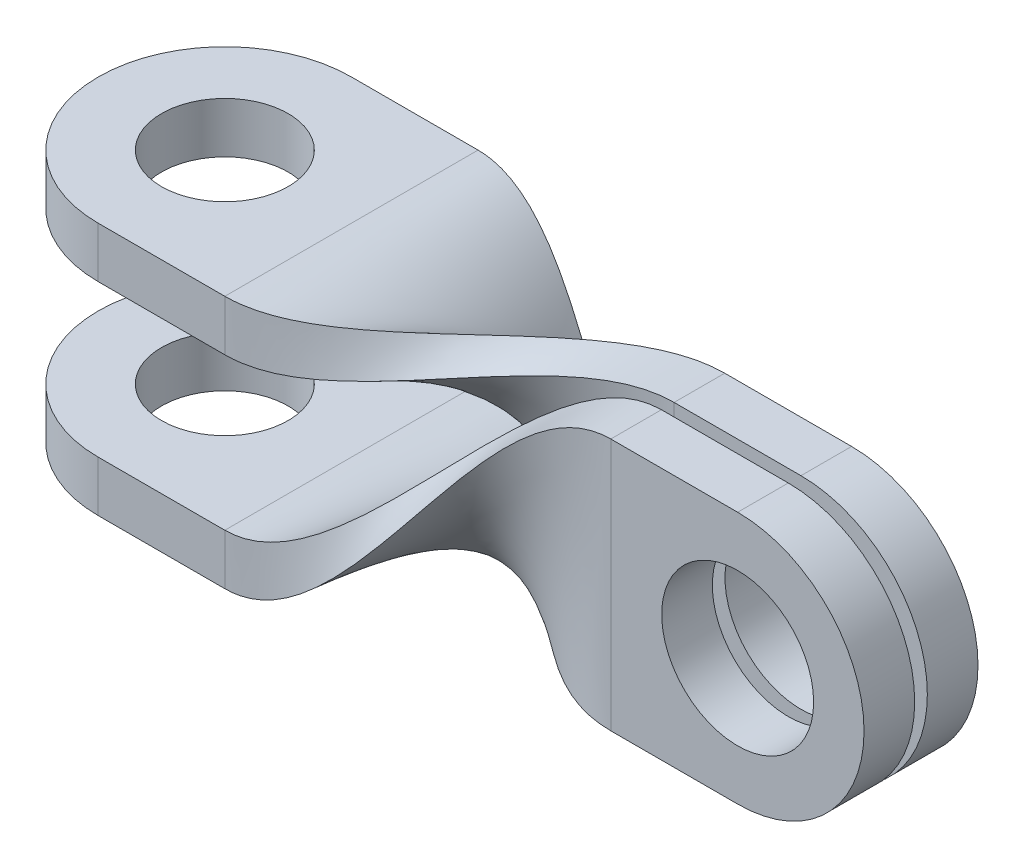
ISO-10303-21;
HEADER;
FILE_DESCRIPTION(('STEP AP214'),'2;1');
FILE_NAME('part.step','',(''),(''),'','','');
FILE_SCHEMA(('AUTOMOTIVE_DESIGN { 1 0 10303 214 1 1 1 1 }'));
ENDSEC;
DATA;
#1=APPLICATION_CONTEXT('core data for automotive mechanical design processes');
#2=APPLICATION_PROTOCOL_DEFINITION('international standard','automotive_design',2000,#1);
#3=PRODUCT_CONTEXT('',#1,'mechanical');
#4=PRODUCT('Part','Part','',(#3));
#5=PRODUCT_RELATED_PRODUCT_CATEGORY('part','',(#4));
#6=PRODUCT_DEFINITION_FORMATION('','',#4);
#7=PRODUCT_DEFINITION_CONTEXT('part definition',#1,'design');
#8=PRODUCT_DEFINITION('design','',#6,#7);
#9=PRODUCT_DEFINITION_SHAPE('','',#8);
#10=(LENGTH_UNIT() NAMED_UNIT(*) SI_UNIT(.MILLI.,.METRE.));
#11=(NAMED_UNIT(*) PLANE_ANGLE_UNIT() SI_UNIT($,.RADIAN.));
#12=(NAMED_UNIT(*) SI_UNIT($,.STERADIAN.) SOLID_ANGLE_UNIT());
#13=UNCERTAINTY_MEASURE_WITH_UNIT(LENGTH_MEASURE(1.E-05),#10,'distance_accuracy_value','');
#14=(GEOMETRIC_REPRESENTATION_CONTEXT(3) GLOBAL_UNCERTAINTY_ASSIGNED_CONTEXT((#13)) GLOBAL_UNIT_ASSIGNED_CONTEXT((#10,
#11,#12)) REPRESENTATION_CONTEXT('',''));
#15=CARTESIAN_POINT('',(0.,0.,0.));
#16=DIRECTION('',(0.,0.,1.));
#17=DIRECTION('',(1.,0.,0.));
#18=AXIS2_PLACEMENT_3D('',#15,#16,#17);
#19=CARTESIAN_POINT('',(-88.9,25.4,-25.4));
#20=DIRECTION('',(0.,0.,1.));
#21=DIRECTION('',(1.,0.,0.));
#22=AXIS2_PLACEMENT_3D('',#19,#20,#21);
#23=PLANE('',#22);
#24=DIRECTION('',(-1.,0.,0.));
#25=VECTOR('',#24,1.);
#26=CARTESIAN_POINT('',(-88.9,-15.24,-25.4));
#27=LINE('',#26,#25);
#28=CARTESIAN_POINT('',(-88.9,-15.24,-25.4));
#29=VERTEX_POINT('',#28);
#30=CARTESIAN_POINT('',(-114.3,-15.24,-25.4));
#31=VERTEX_POINT('',#30);
#32=EDGE_CURVE('E779',#29,#31,#27,.T.);
#33=ORIENTED_EDGE('',*,*,#32,.F.);
#34=DIRECTION('',(0.,1.,0.));
#35=VECTOR('',#34,1.);
#36=CARTESIAN_POINT('',(-88.9,25.4,-25.4));
#37=LINE('',#36,#35);
#38=CARTESIAN_POINT('',(-88.9,-25.4,-25.4));
#39=VERTEX_POINT('',#38);
#40=EDGE_CURVE('E788',#29,#39,#37,.F.);
#41=ORIENTED_EDGE('',*,*,#40,.T.);
#42=DIRECTION('',(-1.,0.,0.));
#43=VECTOR('',#42,1.);
#44=CARTESIAN_POINT('',(-88.9,-25.4,-25.4));
#45=LINE('',#44,#43);
#46=CARTESIAN_POINT('',(-114.3,-25.4,-25.4));
#47=VERTEX_POINT('',#46);
#48=EDGE_CURVE('E784',#39,#47,#45,.T.);
#49=ORIENTED_EDGE('',*,*,#48,.T.);
#50=DIRECTION('',(0.,-1.,0.));
#51=VECTOR('',#50,1.);
#52=CARTESIAN_POINT('',(-114.3,25.4,-25.4));
#53=LINE('',#52,#51);
#54=EDGE_CURVE('E773',#31,#47,#53,.T.);
#55=ORIENTED_EDGE('',*,*,#54,.F.);
#56=EDGE_LOOP('',(#33,#41,#49,#55));
#57=FACE_BOUND('',#56,.T.);
#58=ADVANCED_FACE('F526',(#57),#23,.F.);
#59=CARTESIAN_POINT('',(-114.3,25.4,0.));
#60=DIRECTION('',(0.,-1.,0.));
#61=DIRECTION('',(0.,0.,-1.));
#62=AXIS2_PLACEMENT_3D('',#59,#60,#61);
#63=CYLINDRICAL_SURFACE('',#62,25.4);
#64=CARTESIAN_POINT('',(-114.3,-15.24,0.));
#65=DIRECTION('',(0.,1.,0.));
#66=DIRECTION('',(0.,0.,1.));
#67=AXIS2_PLACEMENT_3D('',#64,#65,#66);
#68=CIRCLE('',#67,25.4);
#69=CARTESIAN_POINT('',(-114.3,-15.24,25.4));
#70=VERTEX_POINT('',#69);
#71=EDGE_CURVE('E537',#31,#70,#68,.T.);
#72=ORIENTED_EDGE('',*,*,#71,.F.);
#73=ORIENTED_EDGE('',*,*,#54,.T.);
#74=CARTESIAN_POINT('',(-114.3,-25.4,0.));
#75=DIRECTION('',(0.,1.,0.));
#76=DIRECTION('',(0.,0.,1.));
#77=AXIS2_PLACEMENT_3D('',#74,#75,#76);
#78=CIRCLE('',#77,25.4);
#79=CARTESIAN_POINT('',(-114.3,-25.4,25.4));
#80=VERTEX_POINT('',#79);
#81=EDGE_CURVE('E769',#47,#80,#78,.T.);
#82=ORIENTED_EDGE('',*,*,#81,.T.);
#83=DIRECTION('',(0.,-1.,0.));
#84=VECTOR('',#83,1.);
#85=CARTESIAN_POINT('',(-114.3,25.4,25.4));
#86=LINE('',#85,#84);
#87=EDGE_CURVE('E772',#70,#80,#86,.T.);
#88=ORIENTED_EDGE('',*,*,#87,.F.);
#89=EDGE_LOOP('',(#72,#73,#82,#88));
#90=FACE_BOUND('',#89,.T.);
#91=ADVANCED_FACE('F853',(#90),#63,.T.);
#92=CARTESIAN_POINT('',(-114.3,25.4,25.4));
#93=DIRECTION('',(0.,0.,-1.));
#94=DIRECTION('',(-1.,0.,0.));
#95=AXIS2_PLACEMENT_3D('',#92,#93,#94);
#96=PLANE('',#95);
#97=DIRECTION('',(1.,0.,0.));
#98=VECTOR('',#97,1.);
#99=CARTESIAN_POINT('',(-114.3,-15.24,25.4));
#100=LINE('',#99,#98);
#101=CARTESIAN_POINT('',(-88.9,-15.24,25.4));
#102=VERTEX_POINT('',#101);
#103=EDGE_CURVE('E14',#70,#102,#100,.T.);
#104=ORIENTED_EDGE('',*,*,#103,.F.);
#105=ORIENTED_EDGE('',*,*,#87,.T.);
#106=DIRECTION('',(1.,0.,0.));
#107=VECTOR('',#106,1.);
#108=CARTESIAN_POINT('',(-114.3,-25.4,25.4));
#109=LINE('',#108,#107);
#110=CARTESIAN_POINT('',(-88.9,-25.4,25.4));
#111=VERTEX_POINT('',#110);
#112=EDGE_CURVE('E782',#80,#111,#109,.T.);
#113=ORIENTED_EDGE('',*,*,#112,.T.);
#114=DIRECTION('',(0.,1.,0.));
#115=VECTOR('',#114,1.);
#116=CARTESIAN_POINT('',(-88.9,25.4,25.4));
#117=LINE('',#116,#115);
#118=EDGE_CURVE('E798',#102,#111,#117,.F.);
#119=ORIENTED_EDGE('',*,*,#118,.F.);
#120=EDGE_LOOP('',(#104,#105,#113,#119));
#121=FACE_BOUND('',#120,.T.);
#122=ADVANCED_FACE('F858',(#121),#96,.F.);
#123=CARTESIAN_POINT('',(-114.3,25.4,0.));
#124=DIRECTION('',(0.,-1.,0.));
#125=DIRECTION('',(0.,0.,-1.));
#126=AXIS2_PLACEMENT_3D('',#123,#124,#125);
#127=CYLINDRICAL_SURFACE('',#126,12.7);
#128=CARTESIAN_POINT('',(-114.3,-25.4,0.));
#129=DIRECTION('',(0.,1.,0.));
#130=DIRECTION('',(0.,0.,1.));
#131=AXIS2_PLACEMENT_3D('',#128,#129,#130);
#132=CIRCLE('',#131,12.7);
#133=CARTESIAN_POINT('',(-114.3,-25.4,12.7));
#134=VERTEX_POINT('',#133);
#135=EDGE_CURVE('E774',#134,#134,#132,.T.);
#136=ORIENTED_EDGE('',*,*,#135,.F.);
#137=EDGE_LOOP('',(#136));
#138=FACE_BOUND('',#137,.T.);
#139=CARTESIAN_POINT('',(-114.3,-15.24,0.));
#140=DIRECTION('',(0.,1.,0.));
#141=DIRECTION('',(0.,0.,1.));
#142=AXIS2_PLACEMENT_3D('',#139,#140,#141);
#143=CIRCLE('',#142,12.7);
#144=CARTESIAN_POINT('',(-114.3,-15.24,12.7));
#145=VERTEX_POINT('',#144);
#146=EDGE_CURVE('E777',#145,#145,#143,.T.);
#147=ORIENTED_EDGE('',*,*,#146,.T.);
#148=EDGE_LOOP('',(#147));
#149=FACE_BOUND('',#148,.T.);
#150=ADVANCED_FACE('F528',(#138,#149),#127,.F.);
#151=CARTESIAN_POINT('',(-114.3,-25.4,0.));
#152=DIRECTION('',(0.,1.,0.));
#153=DIRECTION('',(0.,0.,1.));
#154=AXIS2_PLACEMENT_3D('',#151,#152,#153);
#155=PLANE('',#154);
#156=DIRECTION('',(0.,0.,1.));
#157=VECTOR('',#156,1.);
#158=CARTESIAN_POINT('',(-88.9,-25.4,0.));
#159=LINE('',#158,#157);
#160=EDGE_CURVE('E795',#111,#39,#159,.F.);
#161=ORIENTED_EDGE('',*,*,#160,.F.);
#162=ORIENTED_EDGE('',*,*,#112,.F.);
#163=ORIENTED_EDGE('',*,*,#81,.F.);
#164=ORIENTED_EDGE('',*,*,#48,.F.);
#165=EDGE_LOOP('',(#161,#162,#163,#164));
#166=FACE_BOUND('',#165,.T.);
#167=ORIENTED_EDGE('',*,*,#135,.T.);
#168=EDGE_LOOP('',(#167));
#169=FACE_BOUND('',#168,.T.);
#170=ADVANCED_FACE('F910',(#166,#169),#155,.F.);
#171=CARTESIAN_POINT('',(-114.3,-15.24,0.));
#172=DIRECTION('',(0.,1.,0.));
#173=DIRECTION('',(0.,0.,1.));
#174=AXIS2_PLACEMENT_3D('',#171,#172,#173);
#175=PLANE('',#174);
#176=ORIENTED_EDGE('',*,*,#146,.F.);
#177=EDGE_LOOP('',(#176));
#178=FACE_BOUND('',#177,.T.);
#179=DIRECTION('',(0.,0.,1.));
#180=VECTOR('',#179,1.);
#181=CARTESIAN_POINT('',(-88.9,-15.24,0.));
#182=LINE('',#181,#180);
#183=EDGE_CURVE('E567',#102,#29,#182,.F.);
#184=ORIENTED_EDGE('',*,*,#183,.T.);
#185=ORIENTED_EDGE('',*,*,#32,.T.);
#186=ORIENTED_EDGE('',*,*,#71,.T.);
#187=ORIENTED_EDGE('',*,*,#103,.T.);
#188=EDGE_LOOP('',(#184,#185,#186,#187));
#189=FACE_BOUND('',#188,.T.);
#190=ADVANCED_FACE('F918',(#178,#189),#175,.T.);
#191=CARTESIAN_POINT('',(-25.4473043803096,-25.3526956196904,11.43));
#192=CARTESIAN_POINT('',(-48.581035214057,-25.3526956196904,11.43));
#193=CARTESIAN_POINT('',(-65.7662691662526,-25.4,-25.4));
#194=CARTESIAN_POINT('',(-88.9,-25.4,-25.4));
#195=CARTESIAN_POINT('',(-25.4473043803096,-16.9017970797936,11.43));
#196=CARTESIAN_POINT('',(-48.0227228561521,-16.9017970797936,11.43));
#197=CARTESIAN_POINT('',(-66.3245815241575,-25.4,-16.9333333333333));
#198=CARTESIAN_POINT('',(-88.9,-25.4,-16.9333333333333));
#199=CARTESIAN_POINT('',(-25.4473043803096,0.,11.43));
#200=CARTESIAN_POINT('',(-46.9060981403421,0.,11.43));
#201=CARTESIAN_POINT('',(-67.4412062399675,-25.4,0.));
#202=CARTESIAN_POINT('',(-88.9,-25.4,0.));
#203=CARTESIAN_POINT('',(-25.4473043803096,16.9017970797936,11.43));
#204=CARTESIAN_POINT('',(-49.2331933140537,16.9017970797936,11.43));
#205=CARTESIAN_POINT('',(-65.1141110662559,-25.4,16.9333333333333));
#206=CARTESIAN_POINT('',(-88.9,-25.4,16.9333333333333));
#207=CARTESIAN_POINT('',(-25.4473043803096,25.3526956196904,11.43));
#208=CARTESIAN_POINT('',(-50.3967409009095,25.3526956196904,11.43));
#209=CARTESIAN_POINT('',(-63.9505634794001,-25.4,25.4));
#210=CARTESIAN_POINT('',(-88.9,-25.4,25.4));
#211=B_SPLINE_SURFACE_WITH_KNOTS('',3,3,((#191,#192,#193,#194),(#195,#196,#197,#198),(#199,#200,
#201,#202),(#203,#204,#205,#206),(#207,#208,#209,#210)),.UNSPECIFIED.,.F.,.F.,.F.,(4,1,4),(4,4),
(0.,0.5,1.),(0.,1.),.UNSPECIFIED.);
#212=DIRECTION('',(0.,-1.,0.));
#213=VECTOR('',#212,1.);
#214=CARTESIAN_POINT('',(-25.4473043803096,25.3526956196904,11.43));
#215=LINE('',#214,#213);
#216=CARTESIAN_POINT('',(-25.4473043803096,25.3526956196904,11.43));
#217=VERTEX_POINT('',#216);
#218=CARTESIAN_POINT('',(-25.4473043803096,-25.3526956196904,11.43));
#219=VERTEX_POINT('',#218);
#220=EDGE_CURVE('E580',#217,#219,#215,.T.);
#221=CARTESIAN_POINT('',(-25.4473043803096,25.3526956196904,11.43));
#222=CARTESIAN_POINT('',(-50.3967409009095,25.3526956196904,11.43));
#223=CARTESIAN_POINT('',(-63.9505634794001,-25.4,25.4));
#224=CARTESIAN_POINT('',(-88.9,-25.4,25.4));
#225=B_SPLINE_CURVE_WITH_KNOTS('',3,(#221,#222,#223,#224),.UNSPECIFIED.,.F.,.F.,(4,4),(0.,1.),.UNSPECIFIED.);
#226=EDGE_CURVE('E644',#217,#111,#225,.T.);
#227=CARTESIAN_POINT('',(-25.4473043803096,-25.3526956196904,11.43));
#228=CARTESIAN_POINT('',(-48.581035214057,-25.3526956196904,11.43));
#229=CARTESIAN_POINT('',(-65.7662691662526,-25.4,-25.4));
#230=CARTESIAN_POINT('',(-88.9,-25.4,-25.4));
#231=B_SPLINE_CURVE_WITH_KNOTS('',3,(#227,#228,#229,#230),.UNSPECIFIED.,.F.,.F.,(4,4),(0.,1.),.UNSPECIFIED.);
#232=EDGE_CURVE('E691',#39,#219,#231,.F.);
#233=ORIENTED_EDGE('',*,*,#220,.F.);
#234=ORIENTED_EDGE('',*,*,#226,.T.);
#235=ORIENTED_EDGE('',*,*,#160,.T.);
#236=ORIENTED_EDGE('',*,*,#232,.T.);
#237=EDGE_LOOP('',(#233,#234,#235,#236));
#238=FACE_BOUND('',#237,.T.);
#239=ADVANCED_FACE('F659',(#238),#211,.T.);
#240=CARTESIAN_POINT('',(-25.4473043803096,25.3526956196904,11.43));
#241=CARTESIAN_POINT('',(-50.3967409009095,25.3526956196904,11.43));
#242=CARTESIAN_POINT('',(-63.9505634794001,-25.4,25.4));
#243=CARTESIAN_POINT('',(-88.9,-25.4,25.4));
#244=CARTESIAN_POINT('',(-25.4473043803096,25.3526956196904,9.73666666666667));
#245=CARTESIAN_POINT('',(-50.2548426638721,25.3526956196904,9.73666666666667));
#246=CARTESIAN_POINT('',(-64.0924617164375,-23.7066666666667,25.4));
#247=CARTESIAN_POINT('',(-88.9,-23.7066666666667,25.4));
#248=CARTESIAN_POINT('',(-25.4473043803096,25.3526956196904,6.35));
#249=CARTESIAN_POINT('',(-49.9710461897974,25.3526956196904,6.35));
#250=CARTESIAN_POINT('',(-64.3762581905122,-20.32,25.4));
#251=CARTESIAN_POINT('',(-88.9,-20.32,25.4));
#252=CARTESIAN_POINT('',(-25.4473043803096,25.3526956196904,2.96333333333333));
#253=CARTESIAN_POINT('',(-49.8083347983741,25.3526956196904,2.96333333333333));
#254=CARTESIAN_POINT('',(-64.5389695819355,-16.9333333333333,25.4));
#255=CARTESIAN_POINT('',(-88.9,-16.9333333333333,25.4));
#256=CARTESIAN_POINT('',(-25.4473043803096,25.3526956196904,1.27));
#257=CARTESIAN_POINT('',(-49.7269791026625,25.3526956196904,1.27));
#258=CARTESIAN_POINT('',(-64.6203252776471,-15.24,25.4));
#259=CARTESIAN_POINT('',(-88.9,-15.24,25.4));
#260=B_SPLINE_SURFACE_WITH_KNOTS('',3,3,((#240,#241,#242,#243),(#244,#245,#246,#247),(#248,#249,
#250,#251),(#252,#253,#254,#255),(#256,#257,#258,#259)),.UNSPECIFIED.,.F.,.F.,.F.,(4,1,4),(4,4),
(0.,0.5,1.),(0.,1.),.UNSPECIFIED.);
#261=DIRECTION('',(0.,0.,-1.));
#262=VECTOR('',#261,1.);
#263=CARTESIAN_POINT('',(-25.4473043803096,25.3526956196904,11.43));
#264=LINE('',#263,#262);
#265=CARTESIAN_POINT('',(-25.4473043803096,25.3526956196904,1.27));
#266=VERTEX_POINT('',#265);
#267=EDGE_CURVE('E638',#217,#266,#264,.T.);
#268=CARTESIAN_POINT('',(-25.4473043803096,25.3526956196904,1.27));
#269=CARTESIAN_POINT('',(-49.7269791026625,25.3526956196904,1.27));
#270=CARTESIAN_POINT('',(-64.6203252776471,-15.24,25.4));
#271=CARTESIAN_POINT('',(-88.9,-15.24,25.4));
#272=B_SPLINE_CURVE_WITH_KNOTS('',3,(#268,#269,#270,#271),.UNSPECIFIED.,.F.,.F.,(4,4),(0.,1.),.UNSPECIFIED.);
#273=EDGE_CURVE('E572',#266,#102,#272,.T.);
#274=ORIENTED_EDGE('',*,*,#267,.T.);
#275=ORIENTED_EDGE('',*,*,#273,.T.);
#276=ORIENTED_EDGE('',*,*,#118,.T.);
#277=ORIENTED_EDGE('',*,*,#226,.F.);
#278=EDGE_LOOP('',(#274,#275,#276,#277));
#279=FACE_BOUND('',#278,.T.);
#280=ADVANCED_FACE('F646',(#279),#260,.T.);
#281=CARTESIAN_POINT('',(-25.4473043803096,-25.3526956196904,1.27));
#282=CARTESIAN_POINT('',(-47.8213981535163,-25.3526956196904,1.27));
#283=CARTESIAN_POINT('',(-66.5259062267933,-15.24,-25.4));
#284=CARTESIAN_POINT('',(-88.9,-15.24,-25.4));
#285=CARTESIAN_POINT('',(-25.4473043803096,-25.3526956196904,2.96333333333333));
#286=CARTESIAN_POINT('',(-47.9143390951241,-25.3526956196904,2.96333333333333));
#287=CARTESIAN_POINT('',(-66.4329652851855,-16.9333333333333,-25.4));
#288=CARTESIAN_POINT('',(-88.9,-16.9333333333333,-25.4));
#289=CARTESIAN_POINT('',(-25.4473043803096,-25.3526956196904,6.35));
#290=CARTESIAN_POINT('',(-48.1002209783396,-25.3526956196904,6.35));
#291=CARTESIAN_POINT('',(-66.24708340197,-20.32,-25.4));
#292=CARTESIAN_POINT('',(-88.9,-20.32,-25.4));
#293=CARTESIAN_POINT('',(-25.4473043803096,-25.3526956196904,9.73666666666667));
#294=CARTESIAN_POINT('',(-48.4207638021512,-25.3526956196904,9.73666666666667));
#295=CARTESIAN_POINT('',(-65.9265405781584,-23.7066666666667,-25.4));
#296=CARTESIAN_POINT('',(-88.9,-23.7066666666667,-25.4));
#297=CARTESIAN_POINT('',(-25.4473043803096,-25.3526956196904,11.43));
#298=CARTESIAN_POINT('',(-48.581035214057,-25.3526956196904,11.43));
#299=CARTESIAN_POINT('',(-65.7662691662526,-25.4,-25.4));
#300=CARTESIAN_POINT('',(-88.9,-25.4,-25.4));
#301=B_SPLINE_SURFACE_WITH_KNOTS('',3,3,((#281,#282,#283,#284),(#285,#286,#287,#288),(#289,#290,
#291,#292),(#293,#294,#295,#296),(#297,#298,#299,#300)),.UNSPECIFIED.,.F.,.F.,.F.,(4,1,4),(4,4),
(0.,0.5,1.),(0.,1.),.UNSPECIFIED.);
#302=DIRECTION('',(0.,0.,-1.));
#303=VECTOR('',#302,1.);
#304=CARTESIAN_POINT('',(-25.4473043803096,-25.3526956196904,11.43));
#305=LINE('',#304,#303);
#306=CARTESIAN_POINT('',(-25.4473043803096,-25.3526956196904,1.27));
#307=VERTEX_POINT('',#306);
#308=EDGE_CURVE('E758',#219,#307,#305,.T.);
#309=CARTESIAN_POINT('',(-25.4473043803096,-25.3526956196904,1.27));
#310=CARTESIAN_POINT('',(-47.8213981535163,-25.3526956196904,1.27));
#311=CARTESIAN_POINT('',(-66.5259062267933,-15.24,-25.4));
#312=CARTESIAN_POINT('',(-88.9,-15.24,-25.4));
#313=B_SPLINE_CURVE_WITH_KNOTS('',3,(#309,#310,#311,#312),.UNSPECIFIED.,.F.,.F.,(4,4),(0.,1.),.UNSPECIFIED.);
#314=EDGE_CURVE('E800',#307,#29,#313,.T.);
#315=ORIENTED_EDGE('',*,*,#308,.F.);
#316=ORIENTED_EDGE('',*,*,#232,.F.);
#317=ORIENTED_EDGE('',*,*,#40,.F.);
#318=ORIENTED_EDGE('',*,*,#314,.F.);
#319=EDGE_LOOP('',(#315,#316,#317,#318));
#320=FACE_BOUND('',#319,.T.);
#321=ADVANCED_FACE('F658',(#320),#301,.T.);
#322=CARTESIAN_POINT('',(-25.4473043803096,25.3526956196904,1.27));
#323=CARTESIAN_POINT('',(-49.7269791026625,25.3526956196904,1.27));
#324=CARTESIAN_POINT('',(-64.6203252776471,-15.24,25.4));
#325=CARTESIAN_POINT('',(-88.9,-15.24,25.4));
#326=CARTESIAN_POINT('',(-25.4473043803096,16.9017970797936,1.27));
#327=CARTESIAN_POINT('',(-48.5030755698833,16.9017970797936,1.27));
#328=CARTESIAN_POINT('',(-65.8442288104263,-15.24,16.9333333333333));
#329=CARTESIAN_POINT('',(-88.9,-15.24,16.9333333333333));
#330=CARTESIAN_POINT('',(-25.4473043803096,0.,1.27));
#331=CARTESIAN_POINT('',(-46.0552685043249,0.,1.27));
#332=CARTESIAN_POINT('',(-68.2920358759847,-15.24,0.));
#333=CARTESIAN_POINT('',(-88.9,-15.24,0.));
#334=CARTESIAN_POINT('',(-25.4473043803096,-16.9017970797936,1.27));
#335=CARTESIAN_POINT('',(-47.2326882704525,-16.9017970797936,1.27));
#336=CARTESIAN_POINT('',(-67.1146161098571,-15.24,-16.9333333333333));
#337=CARTESIAN_POINT('',(-88.9,-15.24,-16.9333333333333));
#338=CARTESIAN_POINT('',(-25.4473043803096,-25.3526956196904,1.27));
#339=CARTESIAN_POINT('',(-47.8213981535163,-25.3526956196904,1.27));
#340=CARTESIAN_POINT('',(-66.5259062267933,-15.24,-25.4));
#341=CARTESIAN_POINT('',(-88.9,-15.24,-25.4));
#342=B_SPLINE_SURFACE_WITH_KNOTS('',3,3,((#322,#323,#324,#325),(#326,#327,#328,#329),(#330,#331,
#332,#333),(#334,#335,#336,#337),(#338,#339,#340,#341)),.UNSPECIFIED.,.F.,.F.,.F.,(4,1,4),(4,4),
(0.,0.5,1.),(0.,1.),.UNSPECIFIED.);
#343=DIRECTION('',(0.,-1.,0.));
#344=VECTOR('',#343,1.);
#345=CARTESIAN_POINT('',(-25.4473043803096,25.3526956196904,1.27));
#346=LINE('',#345,#344);
#347=EDGE_CURVE('E530',#266,#307,#346,.T.);
#348=ORIENTED_EDGE('',*,*,#347,.T.);
#349=ORIENTED_EDGE('',*,*,#314,.T.);
#350=ORIENTED_EDGE('',*,*,#183,.F.);
#351=ORIENTED_EDGE('',*,*,#273,.F.);
#352=EDGE_LOOP('',(#348,#349,#350,#351));
#353=FACE_BOUND('',#352,.T.);
#354=ADVANCED_FACE('F674',(#353),#342,.T.);
#355=CARTESIAN_POINT('',(0.,0.,11.43));
#356=DIRECTION('',(0.,0.,1.));
#357=DIRECTION('',(1.,0.,0.));
#358=AXIS2_PLACEMENT_3D('',#355,#356,#357);
#359=PLANE('',#358);
#360=DIRECTION('',(-1.,0.,0.));
#361=VECTOR('',#360,1.);
#362=CARTESIAN_POINT('',(0.,25.3526956196904,11.43));
#363=LINE('',#362,#361);
#364=CARTESIAN_POINT('',(0.,25.3526956196904,11.43));
#365=VERTEX_POINT('',#364);
#366=EDGE_CURVE('E613',#365,#217,#363,.T.);
#367=ORIENTED_EDGE('',*,*,#366,.T.);
#368=ORIENTED_EDGE('',*,*,#220,.T.);
#369=DIRECTION('',(1.,0.,0.));
#370=VECTOR('',#369,1.);
#371=CARTESIAN_POINT('',(-25.4473043803096,-25.3526956196904,11.43));
#372=LINE('',#371,#370);
#373=CARTESIAN_POINT('',(0.,-25.3526956196904,11.43));
#374=VERTEX_POINT('',#373);
#375=EDGE_CURVE('E602',#219,#374,#372,.T.);
#376=ORIENTED_EDGE('',*,*,#375,.T.);
#377=CARTESIAN_POINT('',(0.,0.,11.43));
#378=DIRECTION('',(0.,0.,1.));
#379=DIRECTION('',(1.,0.,0.));
#380=AXIS2_PLACEMENT_3D('',#377,#378,#379);
#381=CIRCLE('',#380,25.3526956196904);
#382=EDGE_CURVE('E608',#374,#365,#381,.T.);
#383=ORIENTED_EDGE('',*,*,#382,.T.);
#384=EDGE_LOOP('',(#367,#368,#376,#383));
#385=FACE_BOUND('',#384,.T.);
#386=CARTESIAN_POINT('',(0.,0.,11.43));
#387=DIRECTION('',(0.,0.,1.));
#388=DIRECTION('',(1.,0.,0.));
#389=AXIS2_PLACEMENT_3D('',#386,#387,#388);
#390=CIRCLE('',#389,15.24);
#391=CARTESIAN_POINT('',(15.24,0.,11.43));
#392=VERTEX_POINT('',#391);
#393=EDGE_CURVE('E725',#392,#392,#390,.T.);
#394=ORIENTED_EDGE('',*,*,#393,.F.);
#395=EDGE_LOOP('',(#394));
#396=FACE_BOUND('',#395,.T.);
#397=ADVANCED_FACE('F605',(#385,#396),#359,.T.);
#398=CARTESIAN_POINT('',(0.,0.,1.27));
#399=DIRECTION('',(0.,0.,1.));
#400=DIRECTION('',(1.,0.,0.));
#401=AXIS2_PLACEMENT_3D('',#398,#399,#400);
#402=PLANE('',#401);
#403=DIRECTION('',(-1.,0.,0.));
#404=VECTOR('',#403,1.);
#405=CARTESIAN_POINT('',(0.,25.3526956196904,1.27));
#406=LINE('',#405,#404);
#407=CARTESIAN_POINT('',(0.,25.3526956196904,1.27));
#408=VERTEX_POINT('',#407);
#409=EDGE_CURVE('E722',#408,#266,#406,.T.);
#410=ORIENTED_EDGE('',*,*,#409,.F.);
#411=CARTESIAN_POINT('',(0.,0.,1.27));
#412=DIRECTION('',(0.,0.,1.));
#413=DIRECTION('',(1.,0.,0.));
#414=AXIS2_PLACEMENT_3D('',#411,#412,#413);
#415=CIRCLE('',#414,25.3526956196904);
#416=CARTESIAN_POINT('',(0.,-25.3526956196904,1.27));
#417=VERTEX_POINT('',#416);
#418=EDGE_CURVE('E633',#417,#408,#415,.T.);
#419=ORIENTED_EDGE('',*,*,#418,.F.);
#420=DIRECTION('',(1.,0.,0.));
#421=VECTOR('',#420,1.);
#422=CARTESIAN_POINT('',(-25.4473043803096,-25.3526956196904,1.27));
#423=LINE('',#422,#421);
#424=EDGE_CURVE('E619',#307,#417,#423,.T.);
#425=ORIENTED_EDGE('',*,*,#424,.F.);
#426=ORIENTED_EDGE('',*,*,#347,.F.);
#427=EDGE_LOOP('',(#410,#419,#425,#426));
#428=FACE_BOUND('',#427,.T.);
#429=CARTESIAN_POINT('',(0.,0.,1.27));
#430=DIRECTION('',(0.,0.,1.));
#431=DIRECTION('',(1.,0.,0.));
#432=AXIS2_PLACEMENT_3D('',#429,#430,#431);
#433=CIRCLE('',#432,15.24);
#434=CARTESIAN_POINT('',(15.24,0.,1.27));
#435=VERTEX_POINT('',#434);
#436=EDGE_CURVE('E631',#435,#435,#433,.T.);
#437=ORIENTED_EDGE('',*,*,#436,.T.);
#438=EDGE_LOOP('',(#437));
#439=FACE_BOUND('',#438,.T.);
#440=ADVANCED_FACE('F733',(#428,#439),#402,.F.);
#441=CARTESIAN_POINT('',(0.,25.3526956196904,11.43));
#442=DIRECTION('',(0.,-1.,0.));
#443=DIRECTION('',(1.,0.,0.));
#444=AXIS2_PLACEMENT_3D('',#441,#442,#443);
#445=PLANE('',#444);
#446=ORIENTED_EDGE('',*,*,#409,.T.);
#447=ORIENTED_EDGE('',*,*,#267,.F.);
#448=ORIENTED_EDGE('',*,*,#366,.F.);
#449=DIRECTION('',(0.,0.,-1.));
#450=VECTOR('',#449,1.);
#451=CARTESIAN_POINT('',(0.,25.3526956196904,11.43));
#452=LINE('',#451,#450);
#453=EDGE_CURVE('E622',#365,#408,#452,.T.);
#454=ORIENTED_EDGE('',*,*,#453,.T.);
#455=EDGE_LOOP('',(#446,#447,#448,#454));
#456=FACE_BOUND('',#455,.T.);
#457=ADVANCED_FACE('F743',(#456),#445,.F.);
#458=CARTESIAN_POINT('',(-25.4473043803096,-25.3526956196904,11.43));
#459=DIRECTION('',(0.,1.,0.));
#460=DIRECTION('',(0.,0.,1.));
#461=AXIS2_PLACEMENT_3D('',#458,#459,#460);
#462=PLANE('',#461);
#463=ORIENTED_EDGE('',*,*,#424,.T.);
#464=DIRECTION('',(0.,0.,-1.));
#465=VECTOR('',#464,1.);
#466=CARTESIAN_POINT('',(0.,-25.3526956196904,11.43));
#467=LINE('',#466,#465);
#468=EDGE_CURVE('E616',#374,#417,#467,.T.);
#469=ORIENTED_EDGE('',*,*,#468,.F.);
#470=ORIENTED_EDGE('',*,*,#375,.F.);
#471=ORIENTED_EDGE('',*,*,#308,.T.);
#472=EDGE_LOOP('',(#463,#469,#470,#471));
#473=FACE_BOUND('',#472,.T.);
#474=ADVANCED_FACE('F617',(#473),#462,.F.);
#475=CARTESIAN_POINT('',(0.,0.,11.43));
#476=DIRECTION('',(0.,0.,-1.));
#477=DIRECTION('',(-1.,0.,0.));
#478=AXIS2_PLACEMENT_3D('',#475,#476,#477);
#479=CYLINDRICAL_SURFACE('',#478,25.3526956196904);
#480=ORIENTED_EDGE('',*,*,#418,.T.);
#481=ORIENTED_EDGE('',*,*,#453,.F.);
#482=ORIENTED_EDGE('',*,*,#382,.F.);
#483=ORIENTED_EDGE('',*,*,#468,.T.);
#484=EDGE_LOOP('',(#480,#481,#482,#483));
#485=FACE_BOUND('',#484,.T.);
#486=ADVANCED_FACE('F624',(#485),#479,.T.);
#487=CARTESIAN_POINT('',(0.,0.,11.43));
#488=DIRECTION('',(0.,0.,-1.));
#489=DIRECTION('',(-1.,0.,0.));
#490=AXIS2_PLACEMENT_3D('',#487,#488,#489);
#491=CYLINDRICAL_SURFACE('',#490,15.24);
#492=ORIENTED_EDGE('',*,*,#393,.T.);
#493=EDGE_LOOP('',(#492));
#494=FACE_BOUND('',#493,.T.);
#495=ORIENTED_EDGE('',*,*,#436,.F.);
#496=EDGE_LOOP('',(#495));
#497=FACE_BOUND('',#496,.T.);
#498=ADVANCED_FACE('F748',(#494,#497),#491,.F.);
#499=CLOSED_SHELL('',(#58,#91,#122,#150,#170,#190,#239,#280,#321,#354,#397,#440,#457,#474,#486,#498));
#500=MANIFOLD_SOLID_BREP('B2',#499);
#501=CARTESIAN_POINT('',(-114.3,25.4,25.4));
#502=DIRECTION('',(0.,0.,-1.));
#503=DIRECTION('',(-1.,0.,0.));
#504=AXIS2_PLACEMENT_3D('',#501,#502,#503);
#505=PLANE('',#504);
#506=DIRECTION('',(0.,-1.,0.));
#507=VECTOR('',#506,1.);
#508=CARTESIAN_POINT('',(-114.3,25.4,25.4));
#509=LINE('',#508,#507);
#510=CARTESIAN_POINT('',(-114.3,25.4,25.4));
#511=VERTEX_POINT('',#510);
#512=CARTESIAN_POINT('',(-114.3,15.24,25.4));
#513=VERTEX_POINT('',#512);
#514=EDGE_CURVE('E1330',#511,#513,#509,.T.);
#515=ORIENTED_EDGE('',*,*,#514,.T.);
#516=DIRECTION('',(1.,0.,0.));
#517=VECTOR('',#516,1.);
#518=CARTESIAN_POINT('',(-114.3,15.24,25.4));
#519=LINE('',#518,#517);
#520=CARTESIAN_POINT('',(-88.9,15.24,25.4));
#521=VERTEX_POINT('',#520);
#522=EDGE_CURVE('E1315',#513,#521,#519,.T.);
#523=ORIENTED_EDGE('',*,*,#522,.T.);
#524=DIRECTION('',(0.,1.,0.));
#525=VECTOR('',#524,1.);
#526=CARTESIAN_POINT('',(-88.9,25.4,25.4));
#527=LINE('',#526,#525);
#528=CARTESIAN_POINT('',(-88.9,25.4,25.4));
#529=VERTEX_POINT('',#528);
#530=EDGE_CURVE('E1294',#529,#521,#527,.F.);
#531=ORIENTED_EDGE('',*,*,#530,.F.);
#532=DIRECTION('',(1.,0.,0.));
#533=VECTOR('',#532,1.);
#534=CARTESIAN_POINT('',(-114.3,25.4,25.4));
#535=LINE('',#534,#533);
#536=EDGE_CURVE('E1336',#511,#529,#535,.T.);
#537=ORIENTED_EDGE('',*,*,#536,.F.);
#538=EDGE_LOOP('',(#515,#523,#531,#537));
#539=FACE_BOUND('',#538,.T.);
#540=ADVANCED_FACE('F1254',(#539),#505,.F.);
#541=CARTESIAN_POINT('',(-114.3,25.4,0.));
#542=DIRECTION('',(0.,-1.,0.));
#543=DIRECTION('',(0.,0.,-1.));
#544=AXIS2_PLACEMENT_3D('',#541,#542,#543);
#545=CYLINDRICAL_SURFACE('',#544,25.4);
#546=DIRECTION('',(0.,-1.,0.));
#547=VECTOR('',#546,1.);
#548=CARTESIAN_POINT('',(-114.3,25.4,-25.4));
#549=LINE('',#548,#547);
#550=CARTESIAN_POINT('',(-114.3,25.4,-25.4));
#551=VERTEX_POINT('',#550);
#552=CARTESIAN_POINT('',(-114.3,15.24,-25.4));
#553=VERTEX_POINT('',#552);
#554=EDGE_CURVE('E1267',#551,#553,#549,.T.);
#555=ORIENTED_EDGE('',*,*,#554,.T.);
#556=CARTESIAN_POINT('',(-114.3,15.24,0.));
#557=DIRECTION('',(0.,1.,0.));
#558=DIRECTION('',(0.,0.,1.));
#559=AXIS2_PLACEMENT_3D('',#556,#557,#558);
#560=CIRCLE('',#559,25.4);
#561=EDGE_CURVE('E1319',#553,#513,#560,.T.);
#562=ORIENTED_EDGE('',*,*,#561,.T.);
#563=ORIENTED_EDGE('',*,*,#514,.F.);
#564=CARTESIAN_POINT('',(-114.3,25.4,0.));
#565=DIRECTION('',(0.,1.,0.));
#566=DIRECTION('',(0.,0.,1.));
#567=AXIS2_PLACEMENT_3D('',#564,#565,#566);
#568=CIRCLE('',#567,25.4);
#569=EDGE_CURVE('E1276',#551,#511,#568,.T.);
#570=ORIENTED_EDGE('',*,*,#569,.F.);
#571=EDGE_LOOP('',(#555,#562,#563,#570));
#572=FACE_BOUND('',#571,.T.);
#573=ADVANCED_FACE('F1329',(#572),#545,.T.);
#574=CARTESIAN_POINT('',(-88.9,25.4,-25.4));
#575=DIRECTION('',(0.,0.,1.));
#576=DIRECTION('',(1.,0.,0.));
#577=AXIS2_PLACEMENT_3D('',#574,#575,#576);
#578=PLANE('',#577);
#579=DIRECTION('',(0.,1.,0.));
#580=VECTOR('',#579,1.);
#581=CARTESIAN_POINT('',(-88.9,25.4,-25.4));
#582=LINE('',#581,#580);
#583=CARTESIAN_POINT('',(-88.9,25.4,-25.4));
#584=VERTEX_POINT('',#583);
#585=CARTESIAN_POINT('',(-88.9,15.24,-25.4));
#586=VERTEX_POINT('',#585);
#587=EDGE_CURVE('E524',#584,#586,#582,.F.);
#588=ORIENTED_EDGE('',*,*,#587,.T.);
#589=DIRECTION('',(-1.,0.,0.));
#590=VECTOR('',#589,1.);
#591=CARTESIAN_POINT('',(-88.9,15.24,-25.4));
#592=LINE('',#591,#590);
#593=EDGE_CURVE('E1334',#586,#553,#592,.T.);
#594=ORIENTED_EDGE('',*,*,#593,.T.);
#595=ORIENTED_EDGE('',*,*,#554,.F.);
#596=DIRECTION('',(-1.,0.,0.));
#597=VECTOR('',#596,1.);
#598=CARTESIAN_POINT('',(-88.9,25.4,-25.4));
#599=LINE('',#598,#597);
#600=EDGE_CURVE('E1346',#584,#551,#599,.T.);
#601=ORIENTED_EDGE('',*,*,#600,.F.);
#602=EDGE_LOOP('',(#588,#594,#595,#601));
#603=FACE_BOUND('',#602,.T.);
#604=ADVANCED_FACE('F1256',(#603),#578,.F.);
#605=CARTESIAN_POINT('',(-114.3,25.4,0.));
#606=DIRECTION('',(0.,1.,0.));
#607=DIRECTION('',(0.,0.,1.));
#608=AXIS2_PLACEMENT_3D('',#605,#606,#607);
#609=PLANE('',#608);
#610=DIRECTION('',(0.,0.,1.));
#611=VECTOR('',#610,1.);
#612=CARTESIAN_POINT('',(-88.9,25.4,0.));
#613=LINE('',#612,#611);
#614=EDGE_CURVE('E1349',#529,#584,#613,.F.);
#615=ORIENTED_EDGE('',*,*,#614,.T.);
#616=ORIENTED_EDGE('',*,*,#600,.T.);
#617=ORIENTED_EDGE('',*,*,#569,.T.);
#618=ORIENTED_EDGE('',*,*,#536,.T.);
#619=EDGE_LOOP('',(#615,#616,#617,#618));
#620=FACE_BOUND('',#619,.T.);
#621=CARTESIAN_POINT('',(-114.3,25.4,0.));
#622=DIRECTION('',(0.,1.,0.));
#623=DIRECTION('',(0.,0.,1.));
#624=AXIS2_PLACEMENT_3D('',#621,#622,#623);
#625=CIRCLE('',#624,12.7);
#626=CARTESIAN_POINT('',(-114.3,25.4,12.7));
#627=VERTEX_POINT('',#626);
#628=EDGE_CURVE('E1325',#627,#627,#625,.T.);
#629=ORIENTED_EDGE('',*,*,#628,.F.);
#630=EDGE_LOOP('',(#629));
#631=FACE_BOUND('',#630,.T.);
#632=ADVANCED_FACE('F1552',(#620,#631),#609,.T.);
#633=CARTESIAN_POINT('',(-114.3,25.4,0.));
#634=DIRECTION('',(0.,-1.,0.));
#635=DIRECTION('',(0.,0.,-1.));
#636=AXIS2_PLACEMENT_3D('',#633,#634,#635);
#637=CYLINDRICAL_SURFACE('',#636,12.7);
#638=CARTESIAN_POINT('',(-114.3,15.24,0.));
#639=DIRECTION('',(0.,1.,0.));
#640=DIRECTION('',(0.,0.,1.));
#641=AXIS2_PLACEMENT_3D('',#638,#639,#640);
#642=CIRCLE('',#641,12.7);
#643=CARTESIAN_POINT('',(-114.3,15.24,12.7));
#644=VERTEX_POINT('',#643);
#645=EDGE_CURVE('E1359',#644,#644,#642,.T.);
#646=ORIENTED_EDGE('',*,*,#645,.F.);
#647=EDGE_LOOP('',(#646));
#648=FACE_BOUND('',#647,.T.);
#649=ORIENTED_EDGE('',*,*,#628,.T.);
#650=EDGE_LOOP('',(#649));
#651=FACE_BOUND('',#650,.T.);
#652=ADVANCED_FACE('F1496',(#648,#651),#637,.F.);
#653=CARTESIAN_POINT('',(-114.3,15.24,0.));
#654=DIRECTION('',(0.,1.,0.));
#655=DIRECTION('',(0.,0.,1.));
#656=AXIS2_PLACEMENT_3D('',#653,#654,#655);
#657=PLANE('',#656);
#658=ORIENTED_EDGE('',*,*,#645,.T.);
#659=EDGE_LOOP('',(#658));
#660=FACE_BOUND('',#659,.T.);
#661=DIRECTION('',(0.,0.,1.));
#662=VECTOR('',#661,1.);
#663=CARTESIAN_POINT('',(-88.9,15.24,0.));
#664=LINE('',#663,#662);
#665=EDGE_CURVE('E1321',#521,#586,#664,.F.);
#666=ORIENTED_EDGE('',*,*,#665,.F.);
#667=ORIENTED_EDGE('',*,*,#522,.F.);
#668=ORIENTED_EDGE('',*,*,#561,.F.);
#669=ORIENTED_EDGE('',*,*,#593,.F.);
#670=EDGE_LOOP('',(#666,#667,#668,#669));
#671=FACE_BOUND('',#670,.T.);
#672=ADVANCED_FACE('F1317',(#660,#671),#657,.F.);
#673=CARTESIAN_POINT('',(-25.4473043803096,-25.3526956196904,-11.43));
#674=CARTESIAN_POINT('',(-50.3967409009095,-25.3526956196904,-11.43));
#675=CARTESIAN_POINT('',(-63.9505634794001,25.4,-25.4));
#676=CARTESIAN_POINT('',(-88.9,25.4,-25.4));
#677=CARTESIAN_POINT('',(-25.4473043803096,-25.3526956196904,-9.73666666666667));
#678=CARTESIAN_POINT('',(-50.2548426638721,-25.3526956196904,-9.73666666666667));
#679=CARTESIAN_POINT('',(-64.0924617164375,23.7066666666667,-25.4));
#680=CARTESIAN_POINT('',(-88.9,23.7066666666667,-25.4));
#681=CARTESIAN_POINT('',(-25.4473043803096,-25.3526956196904,-6.35));
#682=CARTESIAN_POINT('',(-49.9710461897974,-25.3526956196904,-6.35));
#683=CARTESIAN_POINT('',(-64.3762581905122,20.32,-25.4));
#684=CARTESIAN_POINT('',(-88.9,20.32,-25.4));
#685=CARTESIAN_POINT('',(-25.4473043803096,-25.3526956196904,-2.96333333333333));
#686=CARTESIAN_POINT('',(-49.8083347983741,-25.3526956196904,-2.96333333333333));
#687=CARTESIAN_POINT('',(-64.5389695819355,16.9333333333333,-25.4));
#688=CARTESIAN_POINT('',(-88.9,16.9333333333333,-25.4));
#689=CARTESIAN_POINT('',(-25.4473043803096,-25.3526956196904,-1.27));
#690=CARTESIAN_POINT('',(-49.7269791026625,-25.3526956196904,-1.27));
#691=CARTESIAN_POINT('',(-64.6203252776471,15.24,-25.4));
#692=CARTESIAN_POINT('',(-88.9,15.24,-25.4));
#693=B_SPLINE_SURFACE_WITH_KNOTS('',3,3,((#673,#674,#675,#676),(#677,#678,#679,#680),(#681,#682,
#683,#684),(#685,#686,#687,#688),(#689,#690,#691,#692)),.UNSPECIFIED.,.F.,.F.,.F.,(4,1,4),(4,4),
(0.,0.5,1.),(0.,1.),.UNSPECIFIED.);
#694=DIRECTION('',(0.,0.,1.));
#695=VECTOR('',#694,1.);
#696=CARTESIAN_POINT('',(-25.4473043803096,-25.3526956196904,-11.43));
#697=LINE('',#696,#695);
#698=CARTESIAN_POINT('',(-25.4473043803096,-25.3526956196904,-11.43));
#699=VERTEX_POINT('',#698);
#700=CARTESIAN_POINT('',(-25.4473043803096,-25.3526956196904,-1.27));
#701=VERTEX_POINT('',#700);
#702=EDGE_CURVE('E1429',#699,#701,#697,.T.);
#703=CARTESIAN_POINT('',(-25.4473043803096,-25.3526956196904,-1.27));
#704=CARTESIAN_POINT('',(-49.7269791026625,-25.3526956196904,-1.27));
#705=CARTESIAN_POINT('',(-64.6203252776471,15.24,-25.4));
#706=CARTESIAN_POINT('',(-88.9,15.24,-25.4));
#707=B_SPLINE_CURVE_WITH_KNOTS('',3,(#703,#704,#705,#706),.UNSPECIFIED.,.F.,.F.,(4,4),(0.,1.),.UNSPECIFIED.);
#708=EDGE_CURVE('E1303',#701,#586,#707,.T.);
#709=CARTESIAN_POINT('',(-25.4473043803096,-25.3526956196904,-11.43));
#710=CARTESIAN_POINT('',(-50.3967409009095,-25.3526956196904,-11.43));
#711=CARTESIAN_POINT('',(-63.9505634794001,25.4,-25.4));
#712=CARTESIAN_POINT('',(-88.9,25.4,-25.4));
#713=B_SPLINE_CURVE_WITH_KNOTS('',3,(#709,#710,#711,#712),.UNSPECIFIED.,.F.,.F.,(4,4),(0.,1.),.UNSPECIFIED.);
#714=EDGE_CURVE('E1420',#584,#699,#713,.F.);
#715=ORIENTED_EDGE('',*,*,#702,.T.);
#716=ORIENTED_EDGE('',*,*,#708,.T.);
#717=ORIENTED_EDGE('',*,*,#587,.F.);
#718=ORIENTED_EDGE('',*,*,#714,.T.);
#719=EDGE_LOOP('',(#715,#716,#717,#718));
#720=FACE_BOUND('',#719,.T.);
#721=ADVANCED_FACE('F1397',(#720),#693,.T.);
#722=CARTESIAN_POINT('',(-25.4473043803096,-25.3526956196904,-1.27));
#723=CARTESIAN_POINT('',(-49.7269791026625,-25.3526956196904,-1.27));
#724=CARTESIAN_POINT('',(-64.6203252776471,15.24,-25.4));
#725=CARTESIAN_POINT('',(-88.9,15.24,-25.4));
#726=CARTESIAN_POINT('',(-25.4473043803096,-16.9017970797936,-1.27));
#727=CARTESIAN_POINT('',(-48.5030755698833,-16.9017970797936,-1.27));
#728=CARTESIAN_POINT('',(-65.8442288104263,15.24,-16.9333333333333));
#729=CARTESIAN_POINT('',(-88.9,15.24,-16.9333333333333));
#730=CARTESIAN_POINT('',(-25.4473043803096,0.,-1.27));
#731=CARTESIAN_POINT('',(-46.0552685043249,0.,-1.27));
#732=CARTESIAN_POINT('',(-68.2920358759847,15.24,0.));
#733=CARTESIAN_POINT('',(-88.9,15.24,0.));
#734=CARTESIAN_POINT('',(-25.4473043803096,16.9017970797936,-1.27));
#735=CARTESIAN_POINT('',(-47.2326882704525,16.9017970797936,-1.27));
#736=CARTESIAN_POINT('',(-67.1146161098571,15.24,16.9333333333333));
#737=CARTESIAN_POINT('',(-88.9,15.24,16.9333333333333));
#738=CARTESIAN_POINT('',(-25.4473043803096,25.3526956196904,-1.27));
#739=CARTESIAN_POINT('',(-47.8213981535163,25.3526956196904,-1.27));
#740=CARTESIAN_POINT('',(-66.5259062267933,15.24,25.4));
#741=CARTESIAN_POINT('',(-88.9,15.24,25.4));
#742=B_SPLINE_SURFACE_WITH_KNOTS('',3,3,((#722,#723,#724,#725),(#726,#727,#728,#729),(#730,#731,
#732,#733),(#734,#735,#736,#737),(#738,#739,#740,#741)),.UNSPECIFIED.,.F.,.F.,.F.,(4,1,4),(4,4),
(0.,0.5,1.),(0.,1.),.UNSPECIFIED.);
#743=DIRECTION('',(0.,-1.,0.));
#744=VECTOR('',#743,1.);
#745=CARTESIAN_POINT('',(-25.4473043803096,25.3526956196904,-1.27));
#746=LINE('',#745,#744);
#747=CARTESIAN_POINT('',(-25.4473043803096,25.3526956196904,-1.27));
#748=VERTEX_POINT('',#747);
#749=EDGE_CURVE('E1259',#748,#701,#746,.T.);
#750=CARTESIAN_POINT('',(-25.4473043803096,25.3526956196904,-1.27));
#751=CARTESIAN_POINT('',(-47.8213981535163,25.3526956196904,-1.27));
#752=CARTESIAN_POINT('',(-66.5259062267933,15.24,25.4));
#753=CARTESIAN_POINT('',(-88.9,15.24,25.4));
#754=B_SPLINE_CURVE_WITH_KNOTS('',3,(#750,#751,#752,#753),.UNSPECIFIED.,.F.,.F.,(4,4),(0.,1.),.UNSPECIFIED.);
#755=EDGE_CURVE('E1439',#748,#521,#754,.T.);
#756=ORIENTED_EDGE('',*,*,#749,.F.);
#757=ORIENTED_EDGE('',*,*,#755,.T.);
#758=ORIENTED_EDGE('',*,*,#665,.T.);
#759=ORIENTED_EDGE('',*,*,#708,.F.);
#760=EDGE_LOOP('',(#756,#757,#758,#759));
#761=FACE_BOUND('',#760,.T.);
#762=ADVANCED_FACE('F1403',(#761),#742,.T.);
#763=CARTESIAN_POINT('',(-25.4473043803096,25.3526956196904,-11.43));
#764=CARTESIAN_POINT('',(-48.581035214057,25.3526956196904,-11.43));
#765=CARTESIAN_POINT('',(-65.7662691662526,25.4,25.4));
#766=CARTESIAN_POINT('',(-88.9,25.4,25.4));
#767=CARTESIAN_POINT('',(-25.4473043803096,16.9017970797936,-11.43));
#768=CARTESIAN_POINT('',(-48.0227228561521,16.9017970797936,-11.43));
#769=CARTESIAN_POINT('',(-66.3245815241575,25.4,16.9333333333333));
#770=CARTESIAN_POINT('',(-88.9,25.4,16.9333333333333));
#771=CARTESIAN_POINT('',(-25.4473043803096,0.,-11.43));
#772=CARTESIAN_POINT('',(-46.9060981403421,0.,-11.43));
#773=CARTESIAN_POINT('',(-67.4412062399675,25.4,0.));
#774=CARTESIAN_POINT('',(-88.9,25.4,0.));
#775=CARTESIAN_POINT('',(-25.4473043803096,-16.9017970797936,-11.43));
#776=CARTESIAN_POINT('',(-49.2331933140537,-16.9017970797936,-11.43));
#777=CARTESIAN_POINT('',(-65.1141110662559,25.4,-16.9333333333333));
#778=CARTESIAN_POINT('',(-88.9,25.4,-16.9333333333333));
#779=CARTESIAN_POINT('',(-25.4473043803096,-25.3526956196904,-11.43));
#780=CARTESIAN_POINT('',(-50.3967409009095,-25.3526956196904,-11.43));
#781=CARTESIAN_POINT('',(-63.9505634794001,25.4,-25.4));
#782=CARTESIAN_POINT('',(-88.9,25.4,-25.4));
#783=B_SPLINE_SURFACE_WITH_KNOTS('',3,3,((#763,#764,#765,#766),(#767,#768,#769,#770),(#771,#772,
#773,#774),(#775,#776,#777,#778),(#779,#780,#781,#782)),.UNSPECIFIED.,.F.,.F.,.F.,(4,1,4),(4,4),
(0.,0.5,1.),(0.,1.),.UNSPECIFIED.);
#784=DIRECTION('',(0.,-1.,0.));
#785=VECTOR('',#784,1.);
#786=CARTESIAN_POINT('',(-25.4473043803096,25.3526956196904,-11.43));
#787=LINE('',#786,#785);
#788=CARTESIAN_POINT('',(-25.4473043803096,25.3526956196904,-11.43));
#789=VERTEX_POINT('',#788);
#790=EDGE_CURVE('E1685',#789,#699,#787,.T.);
#791=CARTESIAN_POINT('',(-25.4473043803096,25.3526956196904,-11.43));
#792=CARTESIAN_POINT('',(-48.581035214057,25.3526956196904,-11.43));
#793=CARTESIAN_POINT('',(-65.7662691662526,25.4,25.4));
#794=CARTESIAN_POINT('',(-88.9,25.4,25.4));
#795=B_SPLINE_CURVE_WITH_KNOTS('',3,(#791,#792,#793,#794),.UNSPECIFIED.,.F.,.F.,(4,4),(0.,1.),.UNSPECIFIED.);
#796=EDGE_CURVE('E1459',#789,#529,#795,.T.);
#797=ORIENTED_EDGE('',*,*,#790,.T.);
#798=ORIENTED_EDGE('',*,*,#714,.F.);
#799=ORIENTED_EDGE('',*,*,#614,.F.);
#800=ORIENTED_EDGE('',*,*,#796,.F.);
#801=EDGE_LOOP('',(#797,#798,#799,#800));
#802=FACE_BOUND('',#801,.T.);
#803=ADVANCED_FACE('F1484',(#802),#783,.T.);
#804=CARTESIAN_POINT('',(-25.4473043803096,25.3526956196904,-1.27));
#805=CARTESIAN_POINT('',(-47.8213981535163,25.3526956196904,-1.27));
#806=CARTESIAN_POINT('',(-66.5259062267933,15.24,25.4));
#807=CARTESIAN_POINT('',(-88.9,15.24,25.4));
#808=CARTESIAN_POINT('',(-25.4473043803096,25.3526956196904,-2.96333333333333));
#809=CARTESIAN_POINT('',(-47.9143390951241,25.3526956196904,-2.96333333333333));
#810=CARTESIAN_POINT('',(-66.4329652851855,16.9333333333333,25.4));
#811=CARTESIAN_POINT('',(-88.9,16.9333333333333,25.4));
#812=CARTESIAN_POINT('',(-25.4473043803096,25.3526956196904,-6.35));
#813=CARTESIAN_POINT('',(-48.1002209783396,25.3526956196904,-6.35));
#814=CARTESIAN_POINT('',(-66.24708340197,20.32,25.4));
#815=CARTESIAN_POINT('',(-88.9,20.32,25.4));
#816=CARTESIAN_POINT('',(-25.4473043803096,25.3526956196904,-9.73666666666667));
#817=CARTESIAN_POINT('',(-48.4207638021512,25.3526956196904,-9.73666666666667));
#818=CARTESIAN_POINT('',(-65.9265405781584,23.7066666666667,25.4));
#819=CARTESIAN_POINT('',(-88.9,23.7066666666667,25.4));
#820=CARTESIAN_POINT('',(-25.4473043803096,25.3526956196904,-11.43));
#821=CARTESIAN_POINT('',(-48.581035214057,25.3526956196904,-11.43));
#822=CARTESIAN_POINT('',(-65.7662691662526,25.4,25.4));
#823=CARTESIAN_POINT('',(-88.9,25.4,25.4));
#824=B_SPLINE_SURFACE_WITH_KNOTS('',3,3,((#804,#805,#806,#807),(#808,#809,#810,#811),(#812,#813,
#814,#815),(#816,#817,#818,#819),(#820,#821,#822,#823)),.UNSPECIFIED.,.F.,.F.,.F.,(4,1,4),(4,4),
(0.,0.5,1.),(0.,1.),.UNSPECIFIED.);
#825=DIRECTION('',(0.,0.,1.));
#826=VECTOR('',#825,1.);
#827=CARTESIAN_POINT('',(-25.4473043803096,25.3526956196904,-11.43));
#828=LINE('',#827,#826);
#829=EDGE_CURVE('E1375',#789,#748,#828,.T.);
#830=ORIENTED_EDGE('',*,*,#829,.F.);
#831=ORIENTED_EDGE('',*,*,#796,.T.);
#832=ORIENTED_EDGE('',*,*,#530,.T.);
#833=ORIENTED_EDGE('',*,*,#755,.F.);
#834=EDGE_LOOP('',(#830,#831,#832,#833));
#835=FACE_BOUND('',#834,.T.);
#836=ADVANCED_FACE('F1393',(#835),#824,.T.);
#837=CARTESIAN_POINT('',(0.,25.3526956196904,-11.43));
#838=DIRECTION('',(0.,1.,0.));
#839=DIRECTION('',(-1.,0.,0.));
#840=AXIS2_PLACEMENT_3D('',#837,#838,#839);
#841=PLANE('',#840);
#842=DIRECTION('',(-1.,0.,0.));
#843=VECTOR('',#842,1.);
#844=CARTESIAN_POINT('',(0.,25.3526956196904,-1.27));
#845=LINE('',#844,#843);
#846=CARTESIAN_POINT('',(0.,25.3526956196904,-1.27));
#847=VERTEX_POINT('',#846);
#848=EDGE_CURVE('E1360',#847,#748,#845,.T.);
#849=ORIENTED_EDGE('',*,*,#848,.F.);
#850=DIRECTION('',(0.,0.,1.));
#851=VECTOR('',#850,1.);
#852=CARTESIAN_POINT('',(0.,25.3526956196904,-11.43));
#853=LINE('',#852,#851);
#854=CARTESIAN_POINT('',(0.,25.3526956196904,-11.43));
#855=VERTEX_POINT('',#854);
#856=EDGE_CURVE('E1701',#855,#847,#853,.T.);
#857=ORIENTED_EDGE('',*,*,#856,.F.);
#858=DIRECTION('',(-1.,0.,0.));
#859=VECTOR('',#858,1.);
#860=CARTESIAN_POINT('',(0.,25.3526956196904,-11.43));
#861=LINE('',#860,#859);
#862=EDGE_CURVE('E1732',#855,#789,#861,.T.);
#863=ORIENTED_EDGE('',*,*,#862,.T.);
#864=ORIENTED_EDGE('',*,*,#829,.T.);
#865=EDGE_LOOP('',(#849,#857,#863,#864));
#866=FACE_BOUND('',#865,.T.);
#867=ADVANCED_FACE('F1382',(#866),#841,.T.);
#868=CARTESIAN_POINT('',(0.,0.,-11.43));
#869=DIRECTION('',(0.,0.,1.));
#870=DIRECTION('',(1.,0.,0.));
#871=AXIS2_PLACEMENT_3D('',#868,#869,#870);
#872=CYLINDRICAL_SURFACE('',#871,25.3526956196904);
#873=CARTESIAN_POINT('',(0.,0.,-1.27));
#874=DIRECTION('',(0.,0.,1.));
#875=DIRECTION('',(1.,0.,0.));
#876=AXIS2_PLACEMENT_3D('',#873,#874,#875);
#877=CIRCLE('',#876,25.3526956196904);
#878=CARTESIAN_POINT('',(0.,-25.3526956196904,-1.27));
#879=VERTEX_POINT('',#878);
#880=EDGE_CURVE('E1696',#879,#847,#877,.T.);
#881=ORIENTED_EDGE('',*,*,#880,.F.);
#882=DIRECTION('',(0.,0.,1.));
#883=VECTOR('',#882,1.);
#884=CARTESIAN_POINT('',(0.,-25.3526956196904,-11.43));
#885=LINE('',#884,#883);
#886=CARTESIAN_POINT('',(0.,-25.3526956196904,-11.43));
#887=VERTEX_POINT('',#886);
#888=EDGE_CURVE('E1691',#887,#879,#885,.T.);
#889=ORIENTED_EDGE('',*,*,#888,.F.);
#890=CARTESIAN_POINT('',(0.,0.,-11.43));
#891=DIRECTION('',(0.,0.,1.));
#892=DIRECTION('',(1.,0.,0.));
#893=AXIS2_PLACEMENT_3D('',#890,#891,#892);
#894=CIRCLE('',#893,25.3526956196904);
#895=EDGE_CURVE('E1738',#887,#855,#894,.T.);
#896=ORIENTED_EDGE('',*,*,#895,.T.);
#897=ORIENTED_EDGE('',*,*,#856,.T.);
#898=EDGE_LOOP('',(#881,#889,#896,#897));
#899=FACE_BOUND('',#898,.T.);
#900=ADVANCED_FACE('F1392',(#899),#872,.T.);
#901=CARTESIAN_POINT('',(-25.4473043803096,-25.3526956196904,-11.43));
#902=DIRECTION('',(0.,-1.,0.));
#903=DIRECTION('',(0.,0.,-1.));
#904=AXIS2_PLACEMENT_3D('',#901,#902,#903);
#905=PLANE('',#904);
#906=DIRECTION('',(1.,0.,0.));
#907=VECTOR('',#906,1.);
#908=CARTESIAN_POINT('',(-25.4473043803096,-25.3526956196904,-1.27));
#909=LINE('',#908,#907);
#910=EDGE_CURVE('E1364',#701,#879,#909,.T.);
#911=ORIENTED_EDGE('',*,*,#910,.F.);
#912=ORIENTED_EDGE('',*,*,#702,.F.);
#913=DIRECTION('',(1.,0.,0.));
#914=VECTOR('',#913,1.);
#915=CARTESIAN_POINT('',(-25.4473043803096,-25.3526956196904,-11.43));
#916=LINE('',#915,#914);
#917=EDGE_CURVE('E1735',#699,#887,#916,.T.);
#918=ORIENTED_EDGE('',*,*,#917,.T.);
#919=ORIENTED_EDGE('',*,*,#888,.T.);
#920=EDGE_LOOP('',(#911,#912,#918,#919));
#921=FACE_BOUND('',#920,.T.);
#922=ADVANCED_FACE('F1394',(#921),#905,.T.);
#923=CARTESIAN_POINT('',(0.,0.,-11.43));
#924=DIRECTION('',(0.,0.,1.));
#925=DIRECTION('',(1.,0.,0.));
#926=AXIS2_PLACEMENT_3D('',#923,#924,#925);
#927=PLANE('',#926);
#928=CARTESIAN_POINT('',(0.,0.,-11.43));
#929=DIRECTION('',(0.,0.,1.));
#930=DIRECTION('',(1.,0.,0.));
#931=AXIS2_PLACEMENT_3D('',#928,#929,#930);
#932=CIRCLE('',#931,15.24);
#933=CARTESIAN_POINT('',(15.24,0.,-11.43));
#934=VERTEX_POINT('',#933);
#935=EDGE_CURVE('E1365',#934,#934,#932,.T.);
#936=ORIENTED_EDGE('',*,*,#935,.T.);
#937=EDGE_LOOP('',(#936));
#938=FACE_BOUND('',#937,.T.);
#939=ORIENTED_EDGE('',*,*,#862,.F.);
#940=ORIENTED_EDGE('',*,*,#895,.F.);
#941=ORIENTED_EDGE('',*,*,#917,.F.);
#942=ORIENTED_EDGE('',*,*,#790,.F.);
#943=EDGE_LOOP('',(#939,#940,#941,#942));
#944=FACE_BOUND('',#943,.T.);
#945=ADVANCED_FACE('F1716',(#938,#944),#927,.F.);
#946=CARTESIAN_POINT('',(0.,0.,-1.27));
#947=DIRECTION('',(0.,0.,1.));
#948=DIRECTION('',(1.,0.,0.));
#949=AXIS2_PLACEMENT_3D('',#946,#947,#948);
#950=PLANE('',#949);
#951=CARTESIAN_POINT('',(0.,0.,-1.27));
#952=DIRECTION('',(0.,0.,1.));
#953=DIRECTION('',(1.,0.,0.));
#954=AXIS2_PLACEMENT_3D('',#951,#952,#953);
#955=CIRCLE('',#954,15.24);
#956=CARTESIAN_POINT('',(15.24,0.,-1.27));
#957=VERTEX_POINT('',#956);
#958=EDGE_CURVE('E1861',#957,#957,#955,.T.);
#959=ORIENTED_EDGE('',*,*,#958,.F.);
#960=EDGE_LOOP('',(#959));
#961=FACE_BOUND('',#960,.T.);
#962=ORIENTED_EDGE('',*,*,#848,.T.);
#963=ORIENTED_EDGE('',*,*,#749,.T.);
#964=ORIENTED_EDGE('',*,*,#910,.T.);
#965=ORIENTED_EDGE('',*,*,#880,.T.);
#966=EDGE_LOOP('',(#962,#963,#964,#965));
#967=FACE_BOUND('',#966,.T.);
#968=ADVANCED_FACE('F1699',(#961,#967),#950,.T.);
#969=CARTESIAN_POINT('',(0.,0.,-11.43));
#970=DIRECTION('',(0.,0.,1.));
#971=DIRECTION('',(1.,0.,0.));
#972=AXIS2_PLACEMENT_3D('',#969,#970,#971);
#973=CYLINDRICAL_SURFACE('',#972,15.24);
#974=ORIENTED_EDGE('',*,*,#935,.F.);
#975=EDGE_LOOP('',(#974));
#976=FACE_BOUND('',#975,.T.);
#977=ORIENTED_EDGE('',*,*,#958,.T.);
#978=EDGE_LOOP('',(#977));
#979=FACE_BOUND('',#978,.T.);
#980=ADVANCED_FACE('F1715',(#976,#979),#973,.F.);
#981=CLOSED_SHELL('',(#540,#573,#604,#632,#652,#672,#721,#762,#803,#836,#867,#900,#922,#945,
#968,#980));
#982=MANIFOLD_SOLID_BREP('B8',#981);
#983=ADVANCED_BREP_SHAPE_REPRESENTATION('',(#18,#500,#982),#14);
#984=SHAPE_DEFINITION_REPRESENTATION(#9,#983);
ENDSEC;
END-ISO-10303-21;
